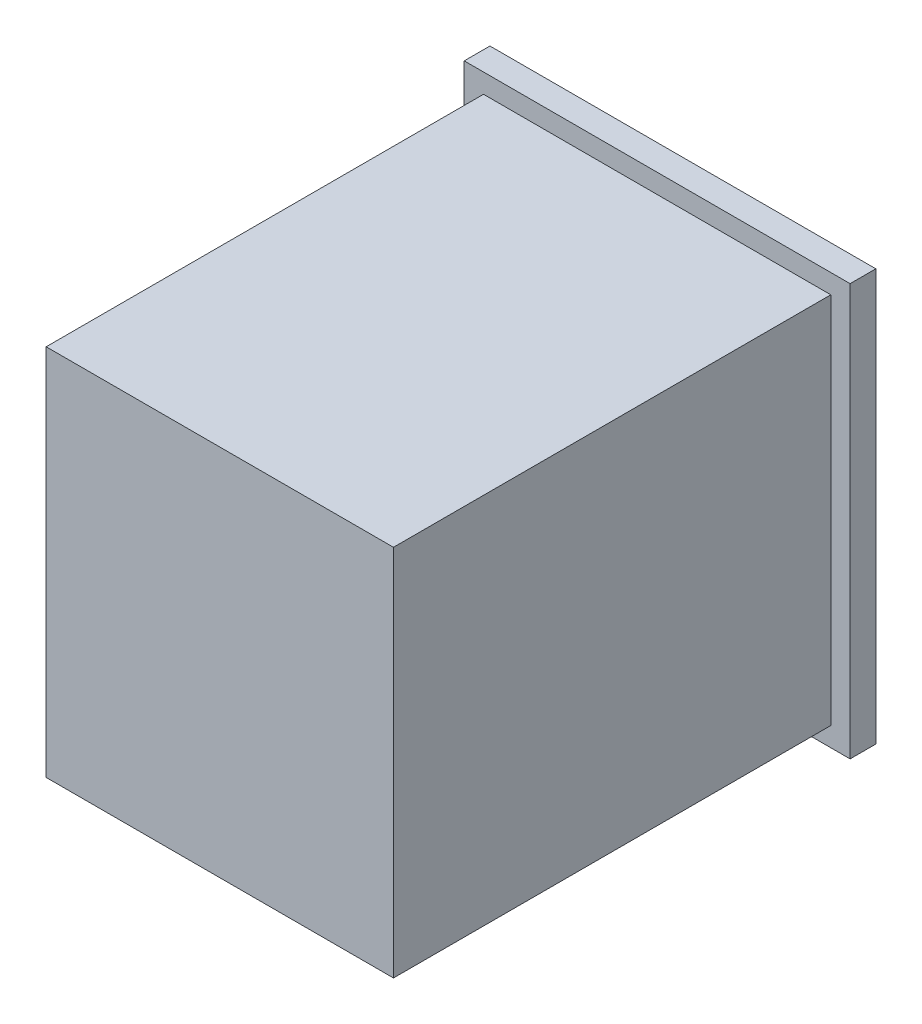
ISO-10303-21;
HEADER;
FILE_DESCRIPTION(('STEP AP214'),'2;1');
FILE_NAME('part.step','',(''),(''),'','','');
FILE_SCHEMA(('AUTOMOTIVE_DESIGN { 1 0 10303 214 1 1 1 1 }'));
ENDSEC;
DATA;
#1=APPLICATION_CONTEXT('core data for automotive mechanical design processes');
#2=APPLICATION_PROTOCOL_DEFINITION('international standard','automotive_design',2000,#1);
#3=PRODUCT_CONTEXT('',#1,'mechanical');
#4=PRODUCT('Part','Part','',(#3));
#5=PRODUCT_RELATED_PRODUCT_CATEGORY('part','',(#4));
#6=PRODUCT_DEFINITION_FORMATION('','',#4);
#7=PRODUCT_DEFINITION_CONTEXT('part definition',#1,'design');
#8=PRODUCT_DEFINITION('design','',#6,#7);
#9=PRODUCT_DEFINITION_SHAPE('','',#8);
#10=(LENGTH_UNIT() NAMED_UNIT(*) SI_UNIT(.MILLI.,.METRE.));
#11=(NAMED_UNIT(*) PLANE_ANGLE_UNIT() SI_UNIT($,.RADIAN.));
#12=(NAMED_UNIT(*) SI_UNIT($,.STERADIAN.) SOLID_ANGLE_UNIT());
#13=UNCERTAINTY_MEASURE_WITH_UNIT(LENGTH_MEASURE(1.E-05),#10,'distance_accuracy_value','');
#14=(GEOMETRIC_REPRESENTATION_CONTEXT(3) GLOBAL_UNCERTAINTY_ASSIGNED_CONTEXT((#13)) GLOBAL_UNIT_ASSIGNED_CONTEXT((#10,
#11,#12)) REPRESENTATION_CONTEXT('',''));
#15=CARTESIAN_POINT('',(0.,0.,0.));
#16=DIRECTION('',(0.,0.,1.));
#17=DIRECTION('',(1.,0.,0.));
#18=AXIS2_PLACEMENT_3D('',#15,#16,#17);
#19=CARTESIAN_POINT('',(6.75,-7.25,17.));
#20=DIRECTION('',(-1.,0.,0.));
#21=DIRECTION('',(0.,0.,1.));
#22=AXIS2_PLACEMENT_3D('',#19,#20,#21);
#23=PLANE('',#22);
#24=DIRECTION('',(0.,1.,0.));
#25=VECTOR('',#24,1.);
#26=CARTESIAN_POINT('',(6.75,-7.25,0.));
#27=LINE('',#26,#25);
#28=CARTESIAN_POINT('',(6.75,-7.25,0.));
#29=VERTEX_POINT('',#28);
#30=CARTESIAN_POINT('',(6.75,7.25,0.));
#31=VERTEX_POINT('',#30);
#32=EDGE_CURVE('E239',#29,#31,#27,.T.);
#33=ORIENTED_EDGE('',*,*,#32,.T.);
#34=DIRECTION('',(0.,0.,-1.));
#35=VECTOR('',#34,1.);
#36=CARTESIAN_POINT('',(6.75,7.25,17.));
#37=LINE('',#36,#35);
#38=CARTESIAN_POINT('',(6.75,7.25,17.));
#39=VERTEX_POINT('',#38);
#40=EDGE_CURVE('E11',#39,#31,#37,.T.);
#41=ORIENTED_EDGE('',*,*,#40,.F.);
#42=DIRECTION('',(0.,1.,0.));
#43=VECTOR('',#42,1.);
#44=CARTESIAN_POINT('',(6.75,-7.25,17.));
#45=LINE('',#44,#43);
#46=CARTESIAN_POINT('',(6.75,-7.25,17.));
#47=VERTEX_POINT('',#46);
#48=EDGE_CURVE('E245',#47,#39,#45,.T.);
#49=ORIENTED_EDGE('',*,*,#48,.F.);
#50=DIRECTION('',(0.,0.,-1.));
#51=VECTOR('',#50,1.);
#52=CARTESIAN_POINT('',(6.75,-7.25,17.));
#53=LINE('',#52,#51);
#54=EDGE_CURVE('E255',#47,#29,#53,.T.);
#55=ORIENTED_EDGE('',*,*,#54,.T.);
#56=EDGE_LOOP('',(#33,#41,#49,#55));
#57=FACE_BOUND('',#56,.T.);
#58=ADVANCED_FACE('F32',(#57),#23,.F.);
#59=CARTESIAN_POINT('',(-6.75,7.25,17.));
#60=DIRECTION('',(0.,-1.,0.));
#61=DIRECTION('',(0.,0.,-1.));
#62=AXIS2_PLACEMENT_3D('',#59,#60,#61);
#63=PLANE('',#62);
#64=DIRECTION('',(-1.,0.,0.));
#65=VECTOR('',#64,1.);
#66=CARTESIAN_POINT('',(-6.75,7.25,0.));
#67=LINE('',#66,#65);
#68=CARTESIAN_POINT('',(-6.75,7.25,0.));
#69=VERTEX_POINT('',#68);
#70=EDGE_CURVE('E258',#31,#69,#67,.T.);
#71=ORIENTED_EDGE('',*,*,#70,.T.);
#72=DIRECTION('',(0.,0.,-1.));
#73=VECTOR('',#72,1.);
#74=CARTESIAN_POINT('',(-6.75,7.25,17.));
#75=LINE('',#74,#73);
#76=CARTESIAN_POINT('',(-6.75,7.25,17.));
#77=VERTEX_POINT('',#76);
#78=EDGE_CURVE('E39',#77,#69,#75,.T.);
#79=ORIENTED_EDGE('',*,*,#78,.F.);
#80=DIRECTION('',(-1.,0.,0.));
#81=VECTOR('',#80,1.);
#82=CARTESIAN_POINT('',(-6.75,7.25,17.));
#83=LINE('',#82,#81);
#84=EDGE_CURVE('E248',#39,#77,#83,.T.);
#85=ORIENTED_EDGE('',*,*,#84,.F.);
#86=ORIENTED_EDGE('',*,*,#40,.T.);
#87=EDGE_LOOP('',(#71,#79,#85,#86));
#88=FACE_BOUND('',#87,.T.);
#89=ADVANCED_FACE('F277',(#88),#63,.F.);
#90=CARTESIAN_POINT('',(-6.75,-7.25,17.));
#91=DIRECTION('',(1.,0.,0.));
#92=DIRECTION('',(0.,0.,-1.));
#93=AXIS2_PLACEMENT_3D('',#90,#91,#92);
#94=PLANE('',#93);
#95=DIRECTION('',(0.,-1.,0.));
#96=VECTOR('',#95,1.);
#97=CARTESIAN_POINT('',(-6.75,-7.25,0.));
#98=LINE('',#97,#96);
#99=CARTESIAN_POINT('',(-6.75,-7.25,0.));
#100=VERTEX_POINT('',#99);
#101=EDGE_CURVE('E261',#69,#100,#98,.T.);
#102=ORIENTED_EDGE('',*,*,#101,.T.);
#103=DIRECTION('',(0.,0.,-1.));
#104=VECTOR('',#103,1.);
#105=CARTESIAN_POINT('',(-6.75,-7.25,17.));
#106=LINE('',#105,#104);
#107=CARTESIAN_POINT('',(-6.75,-7.25,17.));
#108=VERTEX_POINT('',#107);
#109=EDGE_CURVE('E268',#108,#100,#106,.T.);
#110=ORIENTED_EDGE('',*,*,#109,.F.);
#111=DIRECTION('',(0.,-1.,0.));
#112=VECTOR('',#111,1.);
#113=CARTESIAN_POINT('',(-6.75,-7.25,17.));
#114=LINE('',#113,#112);
#115=EDGE_CURVE('E251',#77,#108,#114,.T.);
#116=ORIENTED_EDGE('',*,*,#115,.F.);
#117=ORIENTED_EDGE('',*,*,#78,.T.);
#118=EDGE_LOOP('',(#102,#110,#116,#117));
#119=FACE_BOUND('',#118,.T.);
#120=ADVANCED_FACE('F274',(#119),#94,.F.);
#121=CARTESIAN_POINT('',(-6.75,-7.25,17.));
#122=DIRECTION('',(0.,1.,0.));
#123=DIRECTION('',(0.,0.,1.));
#124=AXIS2_PLACEMENT_3D('',#121,#122,#123);
#125=PLANE('',#124);
#126=DIRECTION('',(1.,0.,0.));
#127=VECTOR('',#126,1.);
#128=CARTESIAN_POINT('',(-6.75,-7.25,0.));
#129=LINE('',#128,#127);
#130=EDGE_CURVE('E249',#100,#29,#129,.T.);
#131=ORIENTED_EDGE('',*,*,#130,.T.);
#132=ORIENTED_EDGE('',*,*,#54,.F.);
#133=DIRECTION('',(1.,0.,0.));
#134=VECTOR('',#133,1.);
#135=CARTESIAN_POINT('',(-6.75,-7.25,17.));
#136=LINE('',#135,#134);
#137=EDGE_CURVE('E253',#108,#47,#136,.T.);
#138=ORIENTED_EDGE('',*,*,#137,.F.);
#139=ORIENTED_EDGE('',*,*,#109,.T.);
#140=EDGE_LOOP('',(#131,#132,#138,#139));
#141=FACE_BOUND('',#140,.T.);
#142=ADVANCED_FACE('F283',(#141),#125,.F.);
#143=CARTESIAN_POINT('',(0.,0.,17.));
#144=DIRECTION('',(0.,0.,-1.));
#145=DIRECTION('',(-1.,0.,0.));
#146=AXIS2_PLACEMENT_3D('',#143,#144,#145);
#147=PLANE('',#146);
#148=ORIENTED_EDGE('',*,*,#48,.T.);
#149=ORIENTED_EDGE('',*,*,#84,.T.);
#150=ORIENTED_EDGE('',*,*,#115,.T.);
#151=ORIENTED_EDGE('',*,*,#137,.T.);
#152=EDGE_LOOP('',(#148,#149,#150,#151));
#153=FACE_BOUND('',#152,.T.);
#154=ADVANCED_FACE('F288',(#153),#147,.F.);
#155=CARTESIAN_POINT('',(0.,0.,0.));
#156=DIRECTION('',(0.,0.,1.));
#157=DIRECTION('',(1.,0.,0.));
#158=AXIS2_PLACEMENT_3D('',#155,#156,#157);
#159=PLANE('',#158);
#160=DIRECTION('',(0.,-1.,0.));
#161=VECTOR('',#160,1.);
#162=CARTESIAN_POINT('',(-7.5,-8.,0.));
#163=LINE('',#162,#161);
#164=CARTESIAN_POINT('',(-7.5,8.,0.));
#165=VERTEX_POINT('',#164);
#166=CARTESIAN_POINT('',(-7.5,-8.,0.));
#167=VERTEX_POINT('',#166);
#168=EDGE_CURVE('E207',#165,#167,#163,.T.);
#169=ORIENTED_EDGE('',*,*,#168,.T.);
#170=DIRECTION('',(1.,0.,0.));
#171=VECTOR('',#170,1.);
#172=CARTESIAN_POINT('',(7.5,-8.,0.));
#173=LINE('',#172,#171);
#174=CARTESIAN_POINT('',(7.5,-8.,0.));
#175=VERTEX_POINT('',#174);
#176=EDGE_CURVE('E229',#167,#175,#173,.T.);
#177=ORIENTED_EDGE('',*,*,#176,.T.);
#178=DIRECTION('',(0.,1.,0.));
#179=VECTOR('',#178,1.);
#180=CARTESIAN_POINT('',(7.5,-8.,0.));
#181=LINE('',#180,#179);
#182=CARTESIAN_POINT('',(7.5,8.,0.));
#183=VERTEX_POINT('',#182);
#184=EDGE_CURVE('E232',#175,#183,#181,.T.);
#185=ORIENTED_EDGE('',*,*,#184,.T.);
#186=DIRECTION('',(-1.,0.,0.));
#187=VECTOR('',#186,1.);
#188=CARTESIAN_POINT('',(7.5,8.,0.));
#189=LINE('',#188,#187);
#190=EDGE_CURVE('E217',#183,#165,#189,.T.);
#191=ORIENTED_EDGE('',*,*,#190,.T.);
#192=EDGE_LOOP('',(#169,#177,#185,#191));
#193=FACE_BOUND('',#192,.T.);
#194=ORIENTED_EDGE('',*,*,#32,.F.);
#195=ORIENTED_EDGE('',*,*,#130,.F.);
#196=ORIENTED_EDGE('',*,*,#101,.F.);
#197=ORIENTED_EDGE('',*,*,#70,.F.);
#198=EDGE_LOOP('',(#194,#195,#196,#197));
#199=FACE_BOUND('',#198,.T.);
#200=ADVANCED_FACE('F280',(#193,#199),#159,.T.);
#201=CARTESIAN_POINT('',(-7.5,-8.,-1.));
#202=DIRECTION('',(-1.,0.,0.));
#203=DIRECTION('',(0.,0.,1.));
#204=AXIS2_PLACEMENT_3D('',#201,#202,#203);
#205=PLANE('',#204);
#206=ORIENTED_EDGE('',*,*,#168,.F.);
#207=DIRECTION('',(0.,0.,1.));
#208=VECTOR('',#207,1.);
#209=CARTESIAN_POINT('',(-7.5,8.,-1.));
#210=LINE('',#209,#208);
#211=CARTESIAN_POINT('',(-7.5,8.,-1.));
#212=VERTEX_POINT('',#211);
#213=EDGE_CURVE('E237',#212,#165,#210,.T.);
#214=ORIENTED_EDGE('',*,*,#213,.F.);
#215=DIRECTION('',(0.,-1.,0.));
#216=VECTOR('',#215,1.);
#217=CARTESIAN_POINT('',(-7.5,-8.,-1.));
#218=LINE('',#217,#216);
#219=CARTESIAN_POINT('',(-7.5,-8.,-1.));
#220=VERTEX_POINT('',#219);
#221=EDGE_CURVE('E213',#212,#220,#218,.T.);
#222=ORIENTED_EDGE('',*,*,#221,.T.);
#223=DIRECTION('',(0.,0.,1.));
#224=VECTOR('',#223,1.);
#225=CARTESIAN_POINT('',(-7.5,-8.,-1.));
#226=LINE('',#225,#224);
#227=EDGE_CURVE('E226',#220,#167,#226,.T.);
#228=ORIENTED_EDGE('',*,*,#227,.T.);
#229=EDGE_LOOP('',(#206,#214,#222,#228));
#230=FACE_BOUND('',#229,.T.);
#231=ADVANCED_FACE('F295',(#230),#205,.T.);
#232=CARTESIAN_POINT('',(7.5,8.,-1.));
#233=DIRECTION('',(0.,1.,0.));
#234=DIRECTION('',(-1.,0.,0.));
#235=AXIS2_PLACEMENT_3D('',#232,#233,#234);
#236=PLANE('',#235);
#237=ORIENTED_EDGE('',*,*,#190,.F.);
#238=DIRECTION('',(0.,0.,1.));
#239=VECTOR('',#238,1.);
#240=CARTESIAN_POINT('',(7.5,8.,-1.));
#241=LINE('',#240,#239);
#242=CARTESIAN_POINT('',(7.5,8.,-1.));
#243=VERTEX_POINT('',#242);
#244=EDGE_CURVE('E240',#243,#183,#241,.T.);
#245=ORIENTED_EDGE('',*,*,#244,.F.);
#246=DIRECTION('',(-1.,0.,0.));
#247=VECTOR('',#246,1.);
#248=CARTESIAN_POINT('',(7.5,8.,-1.));
#249=LINE('',#248,#247);
#250=EDGE_CURVE('E223',#243,#212,#249,.T.);
#251=ORIENTED_EDGE('',*,*,#250,.T.);
#252=ORIENTED_EDGE('',*,*,#213,.T.);
#253=EDGE_LOOP('',(#237,#245,#251,#252));
#254=FACE_BOUND('',#253,.T.);
#255=ADVANCED_FACE('F330',(#254),#236,.T.);
#256=CARTESIAN_POINT('',(7.5,-8.,-1.));
#257=DIRECTION('',(1.,0.,0.));
#258=DIRECTION('',(0.,0.,-1.));
#259=AXIS2_PLACEMENT_3D('',#256,#257,#258);
#260=PLANE('',#259);
#261=ORIENTED_EDGE('',*,*,#184,.F.);
#262=DIRECTION('',(0.,0.,1.));
#263=VECTOR('',#262,1.);
#264=CARTESIAN_POINT('',(7.5,-8.,-1.));
#265=LINE('',#264,#263);
#266=CARTESIAN_POINT('',(7.5,-8.,-1.));
#267=VERTEX_POINT('',#266);
#268=EDGE_CURVE('E242',#267,#175,#265,.T.);
#269=ORIENTED_EDGE('',*,*,#268,.F.);
#270=DIRECTION('',(0.,1.,0.));
#271=VECTOR('',#270,1.);
#272=CARTESIAN_POINT('',(7.5,-8.,-1.));
#273=LINE('',#272,#271);
#274=EDGE_CURVE('E220',#267,#243,#273,.T.);
#275=ORIENTED_EDGE('',*,*,#274,.T.);
#276=ORIENTED_EDGE('',*,*,#244,.T.);
#277=EDGE_LOOP('',(#261,#269,#275,#276));
#278=FACE_BOUND('',#277,.T.);
#279=ADVANCED_FACE('F339',(#278),#260,.T.);
#280=CARTESIAN_POINT('',(7.5,-8.,-1.));
#281=DIRECTION('',(0.,-1.,0.));
#282=DIRECTION('',(1.,0.,0.));
#283=AXIS2_PLACEMENT_3D('',#280,#281,#282);
#284=PLANE('',#283);
#285=ORIENTED_EDGE('',*,*,#176,.F.);
#286=ORIENTED_EDGE('',*,*,#227,.F.);
#287=DIRECTION('',(1.,0.,0.));
#288=VECTOR('',#287,1.);
#289=CARTESIAN_POINT('',(7.5,-8.,-1.));
#290=LINE('',#289,#288);
#291=EDGE_CURVE('E216',#220,#267,#290,.T.);
#292=ORIENTED_EDGE('',*,*,#291,.T.);
#293=ORIENTED_EDGE('',*,*,#268,.T.);
#294=EDGE_LOOP('',(#285,#286,#292,#293));
#295=FACE_BOUND('',#294,.T.);
#296=ADVANCED_FACE('F349',(#295),#284,.T.);
#297=CARTESIAN_POINT('',(0.,0.,-1.));
#298=DIRECTION('',(0.,0.,1.));
#299=DIRECTION('',(1.,0.,0.));
#300=AXIS2_PLACEMENT_3D('',#297,#298,#299);
#301=PLANE('',#300);
#302=DIRECTION('',(-1.,0.,0.));
#303=VECTOR('',#302,1.);
#304=CARTESIAN_POINT('',(6.00000000000001,-6.24999999999999,-1.));
#305=LINE('',#304,#303);
#306=CARTESIAN_POINT('',(6.00000000000001,-6.24999999999999,-1.));
#307=VERTEX_POINT('',#306);
#308=CARTESIAN_POINT('',(-5.99999999999999,-6.25,-1.));
#309=VERTEX_POINT('',#308);
#310=EDGE_CURVE('E173',#307,#309,#305,.T.);
#311=ORIENTED_EDGE('',*,*,#310,.F.);
#312=DIRECTION('',(0.,-1.,0.));
#313=VECTOR('',#312,1.);
#314=CARTESIAN_POINT('',(6.00000000000001,-6.24999999999999,-1.));
#315=LINE('',#314,#313);
#316=CARTESIAN_POINT('',(6.,-1.74999999999999,-1.));
#317=VERTEX_POINT('',#316);
#318=EDGE_CURVE('E46',#317,#307,#315,.T.);
#319=ORIENTED_EDGE('',*,*,#318,.F.);
#320=DIRECTION('',(1.,0.,0.));
#321=VECTOR('',#320,1.);
#322=CARTESIAN_POINT('',(6.,-1.74999999999999,-1.));
#323=LINE('',#322,#321);
#324=CARTESIAN_POINT('',(-6.,-1.75,-1.));
#325=VERTEX_POINT('',#324);
#326=EDGE_CURVE('E164',#325,#317,#323,.T.);
#327=ORIENTED_EDGE('',*,*,#326,.F.);
#328=DIRECTION('',(0.,1.,0.));
#329=VECTOR('',#328,1.);
#330=CARTESIAN_POINT('',(-5.99999999999999,-6.25,-1.));
#331=LINE('',#330,#329);
#332=EDGE_CURVE('E167',#309,#325,#331,.T.);
#333=ORIENTED_EDGE('',*,*,#332,.F.);
#334=EDGE_LOOP('',(#311,#319,#327,#333));
#335=FACE_BOUND('',#334,.T.);
#336=DIRECTION('',(1.,0.,0.));
#337=VECTOR('',#336,1.);
#338=CARTESIAN_POINT('',(6.,6.25,-1.));
#339=LINE('',#338,#337);
#340=CARTESIAN_POINT('',(-6.,6.25,-1.));
#341=VERTEX_POINT('',#340);
#342=CARTESIAN_POINT('',(6.,6.25,-1.));
#343=VERTEX_POINT('',#342);
#344=EDGE_CURVE('E197',#341,#343,#339,.T.);
#345=ORIENTED_EDGE('',*,*,#344,.F.);
#346=DIRECTION('',(0.,1.,0.));
#347=VECTOR('',#346,1.);
#348=CARTESIAN_POINT('',(-6.,6.25,-1.));
#349=LINE('',#348,#347);
#350=CARTESIAN_POINT('',(-6.,1.75,-1.));
#351=VERTEX_POINT('',#350);
#352=EDGE_CURVE('E54',#351,#341,#349,.T.);
#353=ORIENTED_EDGE('',*,*,#352,.F.);
#354=DIRECTION('',(-1.,0.,0.));
#355=VECTOR('',#354,1.);
#356=CARTESIAN_POINT('',(6.,1.75,-1.));
#357=LINE('',#356,#355);
#358=CARTESIAN_POINT('',(6.,1.75,-1.));
#359=VERTEX_POINT('',#358);
#360=EDGE_CURVE('E186',#359,#351,#357,.T.);
#361=ORIENTED_EDGE('',*,*,#360,.F.);
#362=DIRECTION('',(0.,-1.,0.));
#363=VECTOR('',#362,1.);
#364=CARTESIAN_POINT('',(6.,6.25,-1.));
#365=LINE('',#364,#363);
#366=EDGE_CURVE('E200',#343,#359,#365,.T.);
#367=ORIENTED_EDGE('',*,*,#366,.F.);
#368=EDGE_LOOP('',(#345,#353,#361,#367));
#369=FACE_BOUND('',#368,.T.);
#370=ORIENTED_EDGE('',*,*,#221,.F.);
#371=ORIENTED_EDGE('',*,*,#250,.F.);
#372=ORIENTED_EDGE('',*,*,#274,.F.);
#373=ORIENTED_EDGE('',*,*,#291,.F.);
#374=EDGE_LOOP('',(#370,#371,#372,#373));
#375=FACE_BOUND('',#374,.T.);
#376=ADVANCED_FACE('F359',(#335,#369,#375),#301,.F.);
#377=CARTESIAN_POINT('',(-6.,6.25,9.));
#378=DIRECTION('',(-1.,0.,0.));
#379=DIRECTION('',(0.,-1.,0.));
#380=AXIS2_PLACEMENT_3D('',#377,#378,#379);
#381=PLANE('',#380);
#382=ORIENTED_EDGE('',*,*,#352,.T.);
#383=DIRECTION('',(0.,0.,-1.));
#384=VECTOR('',#383,1.);
#385=CARTESIAN_POINT('',(-6.,6.25,9.));
#386=LINE('',#385,#384);
#387=CARTESIAN_POINT('',(-6.,6.25,9.));
#388=VERTEX_POINT('',#387);
#389=EDGE_CURVE('E195',#388,#341,#386,.T.);
#390=ORIENTED_EDGE('',*,*,#389,.F.);
#391=DIRECTION('',(0.,1.,0.));
#392=VECTOR('',#391,1.);
#393=CARTESIAN_POINT('',(-6.,6.25,9.));
#394=LINE('',#393,#392);
#395=CARTESIAN_POINT('',(-6.,1.75,9.));
#396=VERTEX_POINT('',#395);
#397=EDGE_CURVE('E182',#396,#388,#394,.T.);
#398=ORIENTED_EDGE('',*,*,#397,.F.);
#399=DIRECTION('',(0.,0.,-1.));
#400=VECTOR('',#399,1.);
#401=CARTESIAN_POINT('',(-6.,1.75,9.));
#402=LINE('',#401,#400);
#403=EDGE_CURVE('E205',#396,#351,#402,.T.);
#404=ORIENTED_EDGE('',*,*,#403,.T.);
#405=EDGE_LOOP('',(#382,#390,#398,#404));
#406=FACE_BOUND('',#405,.T.);
#407=ADVANCED_FACE('F369',(#406),#381,.F.);
#408=CARTESIAN_POINT('',(6.,1.75,9.));
#409=DIRECTION('',(0.,-1.,0.));
#410=DIRECTION('',(1.,0.,0.));
#411=AXIS2_PLACEMENT_3D('',#408,#409,#410);
#412=PLANE('',#411);
#413=ORIENTED_EDGE('',*,*,#360,.T.);
#414=ORIENTED_EDGE('',*,*,#403,.F.);
#415=DIRECTION('',(-1.,0.,0.));
#416=VECTOR('',#415,1.);
#417=CARTESIAN_POINT('',(6.,1.75,9.));
#418=LINE('',#417,#416);
#419=CARTESIAN_POINT('',(6.,1.75,9.));
#420=VERTEX_POINT('',#419);
#421=EDGE_CURVE('E192',#420,#396,#418,.T.);
#422=ORIENTED_EDGE('',*,*,#421,.F.);
#423=DIRECTION('',(0.,0.,-1.));
#424=VECTOR('',#423,1.);
#425=CARTESIAN_POINT('',(6.,1.75,9.));
#426=LINE('',#425,#424);
#427=EDGE_CURVE('E208',#420,#359,#426,.T.);
#428=ORIENTED_EDGE('',*,*,#427,.T.);
#429=EDGE_LOOP('',(#413,#414,#422,#428));
#430=FACE_BOUND('',#429,.T.);
#431=ADVANCED_FACE('F379',(#430),#412,.F.);
#432=CARTESIAN_POINT('',(6.,6.25,9.));
#433=DIRECTION('',(1.,0.,0.));
#434=DIRECTION('',(0.,1.,0.));
#435=AXIS2_PLACEMENT_3D('',#432,#433,#434);
#436=PLANE('',#435);
#437=ORIENTED_EDGE('',*,*,#366,.T.);
#438=ORIENTED_EDGE('',*,*,#427,.F.);
#439=DIRECTION('',(0.,-1.,0.));
#440=VECTOR('',#439,1.);
#441=CARTESIAN_POINT('',(6.,6.25,9.));
#442=LINE('',#441,#440);
#443=CARTESIAN_POINT('',(6.,6.25,9.));
#444=VERTEX_POINT('',#443);
#445=EDGE_CURVE('E189',#444,#420,#442,.T.);
#446=ORIENTED_EDGE('',*,*,#445,.F.);
#447=DIRECTION('',(0.,0.,-1.));
#448=VECTOR('',#447,1.);
#449=CARTESIAN_POINT('',(6.,6.25,9.));
#450=LINE('',#449,#448);
#451=EDGE_CURVE('E210',#444,#343,#450,.T.);
#452=ORIENTED_EDGE('',*,*,#451,.T.);
#453=EDGE_LOOP('',(#437,#438,#446,#452));
#454=FACE_BOUND('',#453,.T.);
#455=ADVANCED_FACE('F388',(#454),#436,.F.);
#456=CARTESIAN_POINT('',(6.,6.25,9.));
#457=DIRECTION('',(0.,1.,0.));
#458=DIRECTION('',(0.,0.,1.));
#459=AXIS2_PLACEMENT_3D('',#456,#457,#458);
#460=PLANE('',#459);
#461=ORIENTED_EDGE('',*,*,#344,.T.);
#462=ORIENTED_EDGE('',*,*,#451,.F.);
#463=DIRECTION('',(1.,0.,0.));
#464=VECTOR('',#463,1.);
#465=CARTESIAN_POINT('',(6.,6.25,9.));
#466=LINE('',#465,#464);
#467=EDGE_CURVE('E185',#388,#444,#466,.T.);
#468=ORIENTED_EDGE('',*,*,#467,.F.);
#469=ORIENTED_EDGE('',*,*,#389,.T.);
#470=EDGE_LOOP('',(#461,#462,#468,#469));
#471=FACE_BOUND('',#470,.T.);
#472=ADVANCED_FACE('F398',(#471),#460,.F.);
#473=CARTESIAN_POINT('',(0.,0.,9.));
#474=DIRECTION('',(0.,0.,-1.));
#475=DIRECTION('',(-1.,0.,0.));
#476=AXIS2_PLACEMENT_3D('',#473,#474,#475);
#477=PLANE('',#476);
#478=ORIENTED_EDGE('',*,*,#397,.T.);
#479=ORIENTED_EDGE('',*,*,#467,.T.);
#480=ORIENTED_EDGE('',*,*,#445,.T.);
#481=ORIENTED_EDGE('',*,*,#421,.T.);
#482=EDGE_LOOP('',(#478,#479,#480,#481));
#483=FACE_BOUND('',#482,.T.);
#484=ADVANCED_FACE('F408',(#483),#477,.T.);
#485=CARTESIAN_POINT('',(6.00000000000001,-6.24999999999999,9.));
#486=DIRECTION('',(1.,0.,0.));
#487=DIRECTION('',(0.,1.,0.));
#488=AXIS2_PLACEMENT_3D('',#485,#486,#487);
#489=PLANE('',#488);
#490=ORIENTED_EDGE('',*,*,#318,.T.);
#491=DIRECTION('',(0.,0.,-1.));
#492=VECTOR('',#491,1.);
#493=CARTESIAN_POINT('',(6.00000000000001,-6.24999999999999,9.));
#494=LINE('',#493,#492);
#495=CARTESIAN_POINT('',(6.00000000000001,-6.24999999999999,9.));
#496=VERTEX_POINT('',#495);
#497=EDGE_CURVE('E142',#496,#307,#494,.T.);
#498=ORIENTED_EDGE('',*,*,#497,.F.);
#499=DIRECTION('',(0.,-1.,0.));
#500=VECTOR('',#499,1.);
#501=CARTESIAN_POINT('',(6.00000000000001,-6.24999999999999,9.));
#502=LINE('',#501,#500);
#503=CARTESIAN_POINT('',(6.,-1.74999999999999,9.));
#504=VERTEX_POINT('',#503);
#505=EDGE_CURVE('E146',#504,#496,#502,.T.);
#506=ORIENTED_EDGE('',*,*,#505,.F.);
#507=DIRECTION('',(0.,0.,-1.));
#508=VECTOR('',#507,1.);
#509=CARTESIAN_POINT('',(6.,-1.74999999999999,9.));
#510=LINE('',#509,#508);
#511=EDGE_CURVE('E177',#504,#317,#510,.T.);
#512=ORIENTED_EDGE('',*,*,#511,.T.);
#513=EDGE_LOOP('',(#490,#498,#506,#512));
#514=FACE_BOUND('',#513,.T.);
#515=ADVANCED_FACE('F144',(#514),#489,.F.);
#516=CARTESIAN_POINT('',(6.,-1.74999999999999,9.));
#517=DIRECTION('',(0.,1.,0.));
#518=DIRECTION('',(-1.,0.,0.));
#519=AXIS2_PLACEMENT_3D('',#516,#517,#518);
#520=PLANE('',#519);
#521=ORIENTED_EDGE('',*,*,#326,.T.);
#522=ORIENTED_EDGE('',*,*,#511,.F.);
#523=DIRECTION('',(1.,0.,0.));
#524=VECTOR('',#523,1.);
#525=CARTESIAN_POINT('',(6.,-1.74999999999999,9.));
#526=LINE('',#525,#524);
#527=CARTESIAN_POINT('',(-6.,-1.75,9.));
#528=VERTEX_POINT('',#527);
#529=EDGE_CURVE('E152',#528,#504,#526,.T.);
#530=ORIENTED_EDGE('',*,*,#529,.F.);
#531=DIRECTION('',(0.,0.,-1.));
#532=VECTOR('',#531,1.);
#533=CARTESIAN_POINT('',(-6.,-1.75,9.));
#534=LINE('',#533,#532);
#535=EDGE_CURVE('E179',#528,#325,#534,.T.);
#536=ORIENTED_EDGE('',*,*,#535,.T.);
#537=EDGE_LOOP('',(#521,#522,#530,#536));
#538=FACE_BOUND('',#537,.T.);
#539=ADVANCED_FACE('F427',(#538),#520,.F.);
#540=CARTESIAN_POINT('',(-5.99999999999999,-6.25,9.));
#541=DIRECTION('',(-1.,0.,0.));
#542=DIRECTION('',(0.,-1.,0.));
#543=AXIS2_PLACEMENT_3D('',#540,#541,#542);
#544=PLANE('',#543);
#545=ORIENTED_EDGE('',*,*,#332,.T.);
#546=ORIENTED_EDGE('',*,*,#535,.F.);
#547=DIRECTION('',(0.,1.,0.));
#548=VECTOR('',#547,1.);
#549=CARTESIAN_POINT('',(-5.99999999999999,-6.25,9.));
#550=LINE('',#549,#548);
#551=CARTESIAN_POINT('',(-5.99999999999999,-6.25,9.));
#552=VERTEX_POINT('',#551);
#553=EDGE_CURVE('E160',#552,#528,#550,.T.);
#554=ORIENTED_EDGE('',*,*,#553,.F.);
#555=DIRECTION('',(0.,0.,-1.));
#556=VECTOR('',#555,1.);
#557=CARTESIAN_POINT('',(-5.99999999999999,-6.25,9.));
#558=LINE('',#557,#556);
#559=EDGE_CURVE('E151',#552,#309,#558,.T.);
#560=ORIENTED_EDGE('',*,*,#559,.T.);
#561=EDGE_LOOP('',(#545,#546,#554,#560));
#562=FACE_BOUND('',#561,.T.);
#563=ADVANCED_FACE('F436',(#562),#544,.F.);
#564=CARTESIAN_POINT('',(6.00000000000001,-6.24999999999999,9.));
#565=DIRECTION('',(0.,-1.,0.));
#566=DIRECTION('',(1.,0.,0.));
#567=AXIS2_PLACEMENT_3D('',#564,#565,#566);
#568=PLANE('',#567);
#569=ORIENTED_EDGE('',*,*,#310,.T.);
#570=ORIENTED_EDGE('',*,*,#559,.F.);
#571=DIRECTION('',(-1.,0.,0.));
#572=VECTOR('',#571,1.);
#573=CARTESIAN_POINT('',(6.00000000000001,-6.24999999999999,9.));
#574=LINE('',#573,#572);
#575=EDGE_CURVE('E155',#496,#552,#574,.T.);
#576=ORIENTED_EDGE('',*,*,#575,.F.);
#577=ORIENTED_EDGE('',*,*,#497,.T.);
#578=EDGE_LOOP('',(#569,#570,#576,#577));
#579=FACE_BOUND('',#578,.T.);
#580=ADVANCED_FACE('F156',(#579),#568,.F.);
#581=CARTESIAN_POINT('',(0.,0.,9.));
#582=DIRECTION('',(0.,0.,1.));
#583=DIRECTION('',(1.,0.,0.));
#584=AXIS2_PLACEMENT_3D('',#581,#582,#583);
#585=PLANE('',#584);
#586=ORIENTED_EDGE('',*,*,#505,.T.);
#587=ORIENTED_EDGE('',*,*,#575,.T.);
#588=ORIENTED_EDGE('',*,*,#553,.T.);
#589=ORIENTED_EDGE('',*,*,#529,.T.);
#590=EDGE_LOOP('',(#586,#587,#588,#589));
#591=FACE_BOUND('',#590,.T.);
#592=ADVANCED_FACE('F162',(#591),#585,.F.);
#593=CLOSED_SHELL('',(#58,#89,#120,#142,#154,#200,#231,#255,#279,#296,#376,#407,#431,#455,#472,
#484,#515,#539,#563,#580,#592));
#594=MANIFOLD_SOLID_BREP('B2',#593);
#595=ADVANCED_BREP_SHAPE_REPRESENTATION('',(#18,#594),#14);
#596=SHAPE_DEFINITION_REPRESENTATION(#9,#595);
ENDSEC;
END-ISO-10303-21;
